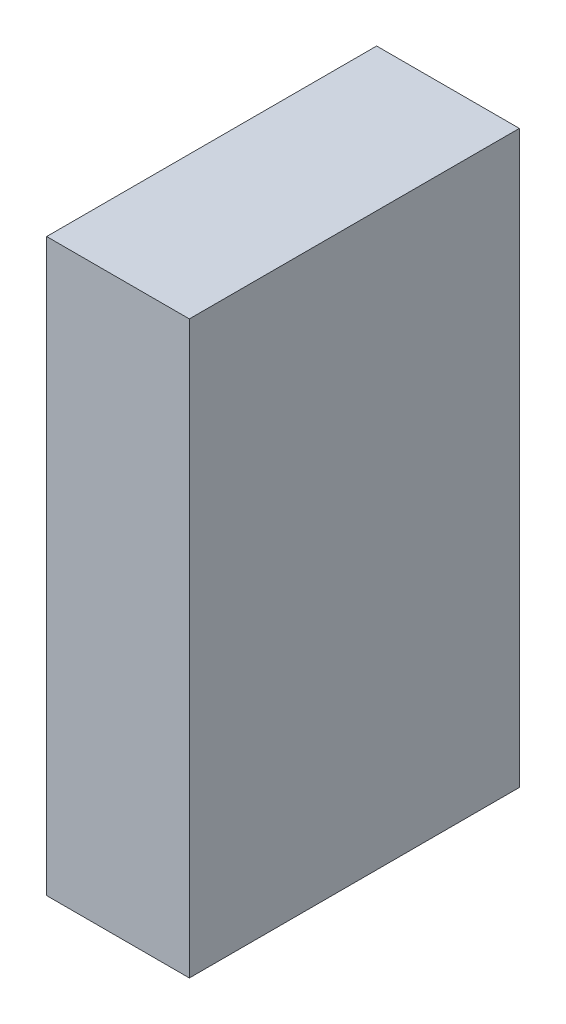
ISO-10303-21;
HEADER;
FILE_DESCRIPTION(('STEP AP214'),'2;1');
FILE_NAME('part.step','',(''),(''),'','','');
FILE_SCHEMA(('AUTOMOTIVE_DESIGN { 1 0 10303 214 1 1 1 1 }'));
ENDSEC;
DATA;
#1=APPLICATION_CONTEXT('core data for automotive mechanical design processes');
#2=APPLICATION_PROTOCOL_DEFINITION('international standard','automotive_design',2000,#1);
#3=PRODUCT_CONTEXT('',#1,'mechanical');
#4=PRODUCT('Part','Part','',(#3));
#5=PRODUCT_RELATED_PRODUCT_CATEGORY('part','',(#4));
#6=PRODUCT_DEFINITION_FORMATION('','',#4);
#7=PRODUCT_DEFINITION_CONTEXT('part definition',#1,'design');
#8=PRODUCT_DEFINITION('design','',#6,#7);
#9=PRODUCT_DEFINITION_SHAPE('','',#8);
#10=(LENGTH_UNIT() NAMED_UNIT(*) SI_UNIT(.MILLI.,.METRE.));
#11=(NAMED_UNIT(*) PLANE_ANGLE_UNIT() SI_UNIT($,.RADIAN.));
#12=(NAMED_UNIT(*) SI_UNIT($,.STERADIAN.) SOLID_ANGLE_UNIT());
#13=UNCERTAINTY_MEASURE_WITH_UNIT(LENGTH_MEASURE(1.E-05),#10,'distance_accuracy_value','');
#14=(GEOMETRIC_REPRESENTATION_CONTEXT(3) GLOBAL_UNCERTAINTY_ASSIGNED_CONTEXT((#13)) GLOBAL_UNIT_ASSIGNED_CONTEXT((#10,
#11,#12)) REPRESENTATION_CONTEXT('',''));
#15=CARTESIAN_POINT('',(0.,0.,0.));
#16=DIRECTION('',(0.,0.,1.));
#17=DIRECTION('',(1.,0.,0.));
#18=AXIS2_PLACEMENT_3D('',#15,#16,#17);
#19=CARTESIAN_POINT('',(-19.05,248.39125631568,44.053125));
#20=DIRECTION('',(1.,0.,0.));
#21=DIRECTION('',(0.,0.,-1.));
#22=AXIS2_PLACEMENT_3D('',#19,#20,#21);
#23=PLANE('',#22);
#24=DIRECTION('',(0.,0.,1.));
#25=VECTOR('',#24,1.);
#26=CARTESIAN_POINT('',(-19.05,152.4,44.053125));
#27=LINE('',#26,#25);
#28=CARTESIAN_POINT('',(-19.0500000000001,152.4,-44.053125));
#29=VERTEX_POINT('',#28);
#30=CARTESIAN_POINT('',(-19.05,152.4,44.053125));
#31=VERTEX_POINT('',#30);
#32=EDGE_CURVE('E39',#29,#31,#27,.T.);
#33=ORIENTED_EDGE('',*,*,#32,.F.);
#34=DIRECTION('',(0.,-1.,0.));
#35=VECTOR('',#34,1.);
#36=CARTESIAN_POINT('',(-19.05,248.39125631568,-44.053125));
#37=LINE('',#36,#35);
#38=CARTESIAN_POINT('',(-19.05,0.,-44.053125));
#39=VERTEX_POINT('',#38);
#40=EDGE_CURVE('E95',#29,#39,#37,.T.);
#41=ORIENTED_EDGE('',*,*,#40,.T.);
#42=DIRECTION('',(0.,0.,1.));
#43=VECTOR('',#42,1.);
#44=CARTESIAN_POINT('',(-19.05,0.,44.053125));
#45=LINE('',#44,#43);
#46=CARTESIAN_POINT('',(-19.05,0.,44.053125));
#47=VERTEX_POINT('',#46);
#48=EDGE_CURVE('E89',#39,#47,#45,.T.);
#49=ORIENTED_EDGE('',*,*,#48,.T.);
#50=DIRECTION('',(0.,-1.,0.));
#51=VECTOR('',#50,1.);
#52=CARTESIAN_POINT('',(-19.05,248.39125631568,44.053125));
#53=LINE('',#52,#51);
#54=EDGE_CURVE('E72',#31,#47,#53,.T.);
#55=ORIENTED_EDGE('',*,*,#54,.F.);
#56=EDGE_LOOP('',(#33,#41,#49,#55));
#57=FACE_BOUND('',#56,.T.);
#58=ADVANCED_FACE('F36',(#57),#23,.F.);
#59=CARTESIAN_POINT('',(19.05,248.39125631568,44.053125));
#60=DIRECTION('',(0.,0.,-1.));
#61=DIRECTION('',(-1.,0.,0.));
#62=AXIS2_PLACEMENT_3D('',#59,#60,#61);
#63=PLANE('',#62);
#64=DIRECTION('',(1.,0.,0.));
#65=VECTOR('',#64,1.);
#66=CARTESIAN_POINT('',(19.05,152.4,44.053125));
#67=LINE('',#66,#65);
#68=CARTESIAN_POINT('',(19.05,152.4,44.053125));
#69=VERTEX_POINT('',#68);
#70=EDGE_CURVE('E51',#31,#69,#67,.T.);
#71=ORIENTED_EDGE('',*,*,#70,.F.);
#72=ORIENTED_EDGE('',*,*,#54,.T.);
#73=DIRECTION('',(1.,0.,0.));
#74=VECTOR('',#73,1.);
#75=CARTESIAN_POINT('',(19.05,0.,44.053125));
#76=LINE('',#75,#74);
#77=CARTESIAN_POINT('',(19.05,0.,44.053125));
#78=VERTEX_POINT('',#77);
#79=EDGE_CURVE('E76',#47,#78,#76,.T.);
#80=ORIENTED_EDGE('',*,*,#79,.T.);
#81=DIRECTION('',(0.,-1.,0.));
#82=VECTOR('',#81,1.);
#83=CARTESIAN_POINT('',(19.05,248.39125631568,44.053125));
#84=LINE('',#83,#82);
#85=EDGE_CURVE('E83',#69,#78,#84,.T.);
#86=ORIENTED_EDGE('',*,*,#85,.F.);
#87=EDGE_LOOP('',(#71,#72,#80,#86));
#88=FACE_BOUND('',#87,.T.);
#89=ADVANCED_FACE('F74',(#88),#63,.F.);
#90=CARTESIAN_POINT('',(19.05,248.39125631568,44.053125));
#91=DIRECTION('',(-1.,0.,0.));
#92=DIRECTION('',(0.,0.,1.));
#93=AXIS2_PLACEMENT_3D('',#90,#91,#92);
#94=PLANE('',#93);
#95=DIRECTION('',(0.,0.,-1.));
#96=VECTOR('',#95,1.);
#97=CARTESIAN_POINT('',(19.05,152.4,44.053125));
#98=LINE('',#97,#96);
#99=CARTESIAN_POINT('',(19.05,152.4,-44.053125));
#100=VERTEX_POINT('',#99);
#101=EDGE_CURVE('E82',#69,#100,#98,.T.);
#102=ORIENTED_EDGE('',*,*,#101,.F.);
#103=ORIENTED_EDGE('',*,*,#85,.T.);
#104=DIRECTION('',(0.,0.,-1.));
#105=VECTOR('',#104,1.);
#106=CARTESIAN_POINT('',(19.05,0.,44.053125));
#107=LINE('',#106,#105);
#108=CARTESIAN_POINT('',(19.05,0.,-44.053125));
#109=VERTEX_POINT('',#108);
#110=EDGE_CURVE('E91',#78,#109,#107,.T.);
#111=ORIENTED_EDGE('',*,*,#110,.T.);
#112=DIRECTION('',(0.,-1.,0.));
#113=VECTOR('',#112,1.);
#114=CARTESIAN_POINT('',(19.05,248.39125631568,-44.053125));
#115=LINE('',#114,#113);
#116=EDGE_CURVE('E110',#100,#109,#115,.T.);
#117=ORIENTED_EDGE('',*,*,#116,.F.);
#118=EDGE_LOOP('',(#102,#103,#111,#117));
#119=FACE_BOUND('',#118,.T.);
#120=ADVANCED_FACE('F115',(#119),#94,.F.);
#121=CARTESIAN_POINT('',(19.05,248.39125631568,-44.053125));
#122=DIRECTION('',(0.,0.,1.));
#123=DIRECTION('',(1.,0.,0.));
#124=AXIS2_PLACEMENT_3D('',#121,#122,#123);
#125=PLANE('',#124);
#126=DIRECTION('',(-1.,0.,0.));
#127=VECTOR('',#126,1.);
#128=CARTESIAN_POINT('',(19.05,152.4,-44.053125));
#129=LINE('',#128,#127);
#130=EDGE_CURVE('E11',#100,#29,#129,.T.);
#131=ORIENTED_EDGE('',*,*,#130,.F.);
#132=ORIENTED_EDGE('',*,*,#116,.T.);
#133=DIRECTION('',(-1.,0.,0.));
#134=VECTOR('',#133,1.);
#135=CARTESIAN_POINT('',(19.05,0.,-44.053125));
#136=LINE('',#135,#134);
#137=EDGE_CURVE('E106',#109,#39,#136,.T.);
#138=ORIENTED_EDGE('',*,*,#137,.T.);
#139=ORIENTED_EDGE('',*,*,#40,.F.);
#140=EDGE_LOOP('',(#131,#132,#138,#139));
#141=FACE_BOUND('',#140,.T.);
#142=ADVANCED_FACE('F122',(#141),#125,.F.);
#143=CARTESIAN_POINT('',(0.,0.,0.));
#144=DIRECTION('',(0.,1.,0.));
#145=DIRECTION('',(0.,0.,1.));
#146=AXIS2_PLACEMENT_3D('',#143,#144,#145);
#147=PLANE('',#146);
#148=ORIENTED_EDGE('',*,*,#48,.F.);
#149=ORIENTED_EDGE('',*,*,#137,.F.);
#150=ORIENTED_EDGE('',*,*,#110,.F.);
#151=ORIENTED_EDGE('',*,*,#79,.F.);
#152=EDGE_LOOP('',(#148,#149,#150,#151));
#153=FACE_BOUND('',#152,.T.);
#154=ADVANCED_FACE('F87',(#153),#147,.F.);
#155=CARTESIAN_POINT('',(-19.0500000000002,152.4,-876.3));
#156=DIRECTION('',(0.,1.,0.));
#157=DIRECTION('',(1.,0.,0.));
#158=AXIS2_PLACEMENT_3D('',#155,#156,#157);
#159=PLANE('',#158);
#160=ORIENTED_EDGE('',*,*,#70,.T.);
#161=ORIENTED_EDGE('',*,*,#101,.T.);
#162=ORIENTED_EDGE('',*,*,#130,.T.);
#163=ORIENTED_EDGE('',*,*,#32,.T.);
#164=EDGE_LOOP('',(#160,#161,#162,#163));
#165=FACE_BOUND('',#164,.T.);
#166=ADVANCED_FACE('F120',(#165),#159,.T.);
#167=CLOSED_SHELL('',(#58,#89,#120,#142,#154,#166));
#168=MANIFOLD_SOLID_BREP('B2',#167);
#169=ADVANCED_BREP_SHAPE_REPRESENTATION('',(#18,#168),#14);
#170=SHAPE_DEFINITION_REPRESENTATION(#9,#169);
ENDSEC;
END-ISO-10303-21;
